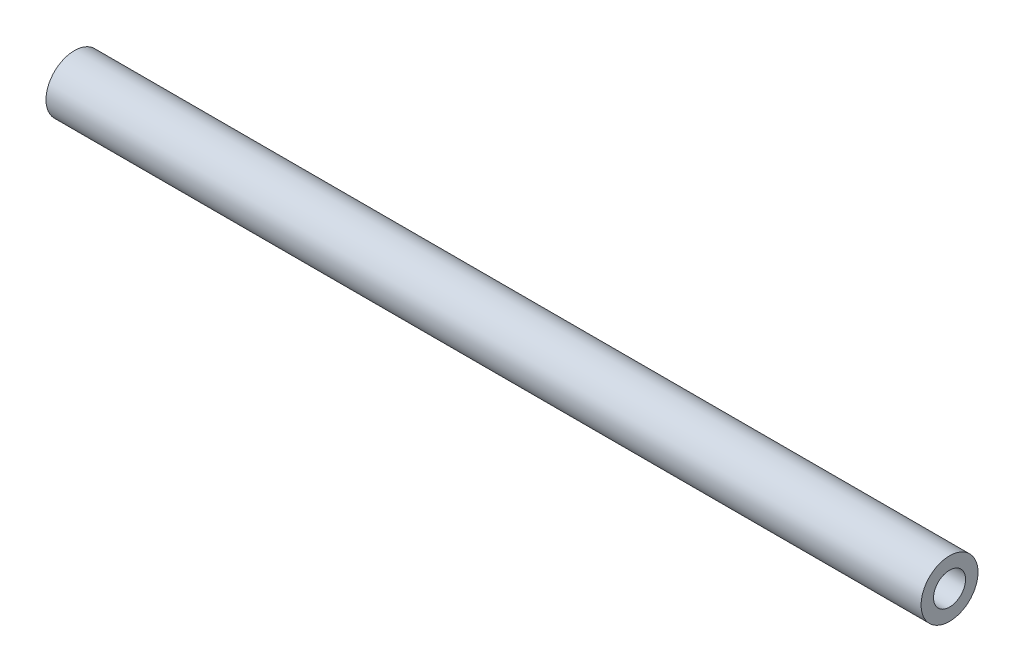
ISO-10303-21;
HEADER;
FILE_DESCRIPTION(('STEP AP214'),'2;1');
FILE_NAME('part.step','',(''),(''),'','','');
FILE_SCHEMA(('AUTOMOTIVE_DESIGN { 1 0 10303 214 1 1 1 1 }'));
ENDSEC;
DATA;
#1=APPLICATION_CONTEXT('core data for automotive mechanical design processes');
#2=APPLICATION_PROTOCOL_DEFINITION('international standard','automotive_design',2000,#1);
#3=PRODUCT_CONTEXT('',#1,'mechanical');
#4=PRODUCT('Part','Part','',(#3));
#5=PRODUCT_RELATED_PRODUCT_CATEGORY('part','',(#4));
#6=PRODUCT_DEFINITION_FORMATION('','',#4);
#7=PRODUCT_DEFINITION_CONTEXT('part definition',#1,'design');
#8=PRODUCT_DEFINITION('design','',#6,#7);
#9=PRODUCT_DEFINITION_SHAPE('','',#8);
#10=(LENGTH_UNIT() NAMED_UNIT(*) SI_UNIT(.MILLI.,.METRE.));
#11=(NAMED_UNIT(*) PLANE_ANGLE_UNIT() SI_UNIT($,.RADIAN.));
#12=(NAMED_UNIT(*) SI_UNIT($,.STERADIAN.) SOLID_ANGLE_UNIT());
#13=UNCERTAINTY_MEASURE_WITH_UNIT(LENGTH_MEASURE(1.E-05),#10,'distance_accuracy_value','');
#14=(GEOMETRIC_REPRESENTATION_CONTEXT(3) GLOBAL_UNCERTAINTY_ASSIGNED_CONTEXT((#13)) GLOBAL_UNIT_ASSIGNED_CONTEXT((#10,
#11,#12)) REPRESENTATION_CONTEXT('',''));
#15=CARTESIAN_POINT('',(0.,0.,0.));
#16=DIRECTION('',(0.,0.,1.));
#17=DIRECTION('',(1.,0.,0.));
#18=AXIS2_PLACEMENT_3D('',#15,#16,#17);
#19=CARTESIAN_POINT('',(-7.00000000000001,2.69861313868613,72.1941406768414));
#20=DIRECTION('',(-1.,0.,0.));
#21=DIRECTION('',(0.,0.,1.));
#22=AXIS2_PLACEMENT_3D('',#19,#20,#21);
#23=CYLINDRICAL_SURFACE('',#22,0.399999999999991);
#24=CARTESIAN_POINT('',(-22.15,2.69861313868613,72.1941406768414));
#25=DIRECTION('',(1.,0.,0.));
#26=DIRECTION('',(0.,1.,0.));
#27=AXIS2_PLACEMENT_3D('',#24,#25,#26);
#28=CIRCLE('',#27,0.399999999999991);
#29=CARTESIAN_POINT('',(-22.15,3.09861313868612,72.1941406768414));
#30=VERTEX_POINT('',#29);
#31=EDGE_CURVE('E10',#30,#30,#28,.T.);
#32=ORIENTED_EDGE('',*,*,#31,.T.);
#33=EDGE_LOOP('',(#32));
#34=FACE_BOUND('',#33,.T.);
#35=CARTESIAN_POINT('',(-9.85,2.69861313868613,72.1941406768414));
#36=DIRECTION('',(-1.,0.,0.));
#37=DIRECTION('',(0.,-1.,0.));
#38=AXIS2_PLACEMENT_3D('',#35,#36,#37);
#39=CIRCLE('',#38,0.399999999999991);
#40=CARTESIAN_POINT('',(-9.85,2.29861313868614,72.1941406768414));
#41=VERTEX_POINT('',#40);
#42=EDGE_CURVE('E47',#41,#41,#39,.T.);
#43=ORIENTED_EDGE('',*,*,#42,.T.);
#44=EDGE_LOOP('',(#43));
#45=FACE_BOUND('',#44,.T.);
#46=ADVANCED_FACE('F40',(#34,#45),#23,.T.);
#47=CARTESIAN_POINT('',(-9.85,8.41974839769905,-63.4545454545454));
#48=DIRECTION('',(-1.,0.,0.));
#49=DIRECTION('',(0.,-1.,0.));
#50=AXIS2_PLACEMENT_3D('',#47,#48,#49);
#51=PLANE('',#50);
#52=CARTESIAN_POINT('',(-9.85,2.69861313868613,72.1941406768414));
#53=DIRECTION('',(1.,0.,0.));
#54=DIRECTION('',(0.,1.,0.));
#55=AXIS2_PLACEMENT_3D('',#52,#53,#54);
#56=CIRCLE('',#55,0.225000000000001);
#57=CARTESIAN_POINT('',(-9.85,2.92361313868613,72.1941406768414));
#58=VERTEX_POINT('',#57);
#59=EDGE_CURVE('E57',#58,#58,#56,.T.);
#60=ORIENTED_EDGE('',*,*,#59,.F.);
#61=EDGE_LOOP('',(#60));
#62=FACE_BOUND('',#61,.T.);
#63=ORIENTED_EDGE('',*,*,#42,.F.);
#64=EDGE_LOOP('',(#63));
#65=FACE_BOUND('',#64,.T.);
#66=ADVANCED_FACE('F85',(#62,#65),#51,.F.);
#67=CARTESIAN_POINT('',(-22.15,8.41974839769905,-63.4545454545454));
#68=DIRECTION('',(1.,0.,0.));
#69=DIRECTION('',(0.,1.,0.));
#70=AXIS2_PLACEMENT_3D('',#67,#68,#69);
#71=PLANE('',#70);
#72=CARTESIAN_POINT('',(-22.15,2.69861313868614,72.1941406768414));
#73=DIRECTION('',(-1.,0.,0.));
#74=DIRECTION('',(0.,-1.,0.));
#75=AXIS2_PLACEMENT_3D('',#72,#73,#74);
#76=CIRCLE('',#75,0.225000000000001);
#77=CARTESIAN_POINT('',(-22.15,2.47361313868613,72.1941406768414));
#78=VERTEX_POINT('',#77);
#79=EDGE_CURVE('E64',#78,#78,#76,.T.);
#80=ORIENTED_EDGE('',*,*,#79,.F.);
#81=EDGE_LOOP('',(#80));
#82=FACE_BOUND('',#81,.T.);
#83=ORIENTED_EDGE('',*,*,#31,.F.);
#84=EDGE_LOOP('',(#83));
#85=FACE_BOUND('',#84,.T.);
#86=ADVANCED_FACE('F81',(#82,#85),#71,.F.);
#87=CARTESIAN_POINT('',(-11.05,2.69861313868613,72.1941406768414));
#88=DIRECTION('',(1.,0.,0.));
#89=DIRECTION('',(0.,1.,0.));
#90=AXIS2_PLACEMENT_3D('',#87,#88,#89);
#91=CYLINDRICAL_SURFACE('',#90,0.225000000000001);
#92=CARTESIAN_POINT('',(-11.05,2.69861313868613,72.1941406768414));
#93=DIRECTION('',(1.,0.,0.));
#94=DIRECTION('',(0.,1.,0.));
#95=AXIS2_PLACEMENT_3D('',#92,#93,#94);
#96=CIRCLE('',#95,0.225000000000001);
#97=CARTESIAN_POINT('',(-11.05,2.92361313868613,72.1941406768414));
#98=VERTEX_POINT('',#97);
#99=EDGE_CURVE('E52',#98,#98,#96,.T.);
#100=ORIENTED_EDGE('',*,*,#99,.F.);
#101=EDGE_LOOP('',(#100));
#102=FACE_BOUND('',#101,.T.);
#103=ORIENTED_EDGE('',*,*,#59,.T.);
#104=EDGE_LOOP('',(#103));
#105=FACE_BOUND('',#104,.T.);
#106=ADVANCED_FACE('F84',(#102,#105),#91,.F.);
#107=CARTESIAN_POINT('',(-11.05,2.69861313868613,72.1941406768414));
#108=DIRECTION('',(1.,0.,0.));
#109=DIRECTION('',(0.,1.,0.));
#110=AXIS2_PLACEMENT_3D('',#107,#108,#109);
#111=PLANE('',#110);
#112=ORIENTED_EDGE('',*,*,#99,.T.);
#113=EDGE_LOOP('',(#112));
#114=FACE_BOUND('',#113,.T.);
#115=ADVANCED_FACE('F77',(#114),#111,.T.);
#116=CARTESIAN_POINT('',(-20.95,2.69861313868614,72.1941406768414));
#117=DIRECTION('',(-1.,0.,0.));
#118=DIRECTION('',(0.,-1.,0.));
#119=AXIS2_PLACEMENT_3D('',#116,#117,#118);
#120=CYLINDRICAL_SURFACE('',#119,0.225000000000001);
#121=CARTESIAN_POINT('',(-20.95,2.69861313868614,72.1941406768414));
#122=DIRECTION('',(-1.,0.,0.));
#123=DIRECTION('',(0.,-1.,0.));
#124=AXIS2_PLACEMENT_3D('',#121,#122,#123);
#125=CIRCLE('',#124,0.225000000000001);
#126=CARTESIAN_POINT('',(-20.95,2.47361313868614,72.1941406768414));
#127=VERTEX_POINT('',#126);
#128=EDGE_CURVE('E62',#127,#127,#125,.T.);
#129=ORIENTED_EDGE('',*,*,#128,.F.);
#130=EDGE_LOOP('',(#129));
#131=FACE_BOUND('',#130,.T.);
#132=ORIENTED_EDGE('',*,*,#79,.T.);
#133=EDGE_LOOP('',(#132));
#134=FACE_BOUND('',#133,.T.);
#135=ADVANCED_FACE('F74',(#131,#134),#120,.F.);
#136=CARTESIAN_POINT('',(-20.95,2.69861313868614,72.1941406768414));
#137=DIRECTION('',(-1.,0.,0.));
#138=DIRECTION('',(0.,-1.,0.));
#139=AXIS2_PLACEMENT_3D('',#136,#137,#138);
#140=PLANE('',#139);
#141=ORIENTED_EDGE('',*,*,#128,.T.);
#142=EDGE_LOOP('',(#141));
#143=FACE_BOUND('',#142,.T.);
#144=ADVANCED_FACE('F72',(#143),#140,.T.);
#145=CLOSED_SHELL('',(#46,#66,#86,#106,#115,#135,#144));
#146=MANIFOLD_SOLID_BREP('B2',#145);
#147=ADVANCED_BREP_SHAPE_REPRESENTATION('',(#18,#146),#14);
#148=SHAPE_DEFINITION_REPRESENTATION(#9,#147);
ENDSEC;
END-ISO-10303-21;
